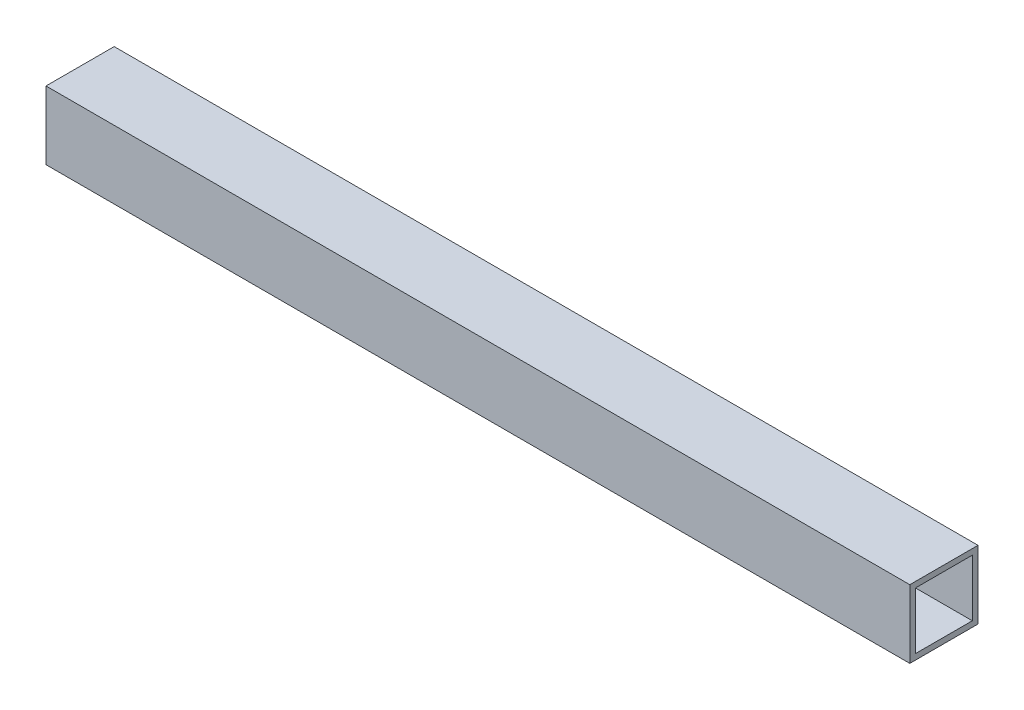
ISO-10303-21;
HEADER;
FILE_DESCRIPTION(('STEP AP214'),'2;1');
FILE_NAME('part.step','',(''),(''),'','','');
FILE_SCHEMA(('AUTOMOTIVE_DESIGN { 1 0 10303 214 1 1 1 1 }'));
ENDSEC;
DATA;
#1=APPLICATION_CONTEXT('core data for automotive mechanical design processes');
#2=APPLICATION_PROTOCOL_DEFINITION('international standard','automotive_design',2000,#1);
#3=PRODUCT_CONTEXT('',#1,'mechanical');
#4=PRODUCT('Part','Part','',(#3));
#5=PRODUCT_RELATED_PRODUCT_CATEGORY('part','',(#4));
#6=PRODUCT_DEFINITION_FORMATION('','',#4);
#7=PRODUCT_DEFINITION_CONTEXT('part definition',#1,'design');
#8=PRODUCT_DEFINITION('design','',#6,#7);
#9=PRODUCT_DEFINITION_SHAPE('','',#8);
#10=(LENGTH_UNIT() NAMED_UNIT(*) SI_UNIT(.MILLI.,.METRE.));
#11=(NAMED_UNIT(*) PLANE_ANGLE_UNIT() SI_UNIT($,.RADIAN.));
#12=(NAMED_UNIT(*) SI_UNIT($,.STERADIAN.) SOLID_ANGLE_UNIT());
#13=UNCERTAINTY_MEASURE_WITH_UNIT(LENGTH_MEASURE(1.E-05),#10,'distance_accuracy_value','');
#14=(GEOMETRIC_REPRESENTATION_CONTEXT(3) GLOBAL_UNCERTAINTY_ASSIGNED_CONTEXT((#13)) GLOBAL_UNIT_ASSIGNED_CONTEXT((#10,
#11,#12)) REPRESENTATION_CONTEXT('',''));
#15=CARTESIAN_POINT('',(0.,0.,0.));
#16=DIRECTION('',(0.,0.,1.));
#17=DIRECTION('',(1.,0.,0.));
#18=AXIS2_PLACEMENT_3D('',#15,#16,#17);
#19=CARTESIAN_POINT('',(241.3,0.,0.));
#20=DIRECTION('',(-1.,0.,0.));
#21=DIRECTION('',(0.,0.,1.));
#22=AXIS2_PLACEMENT_3D('',#19,#20,#21);
#23=PLANE('',#22);
#24=DIRECTION('',(0.,1.,0.));
#25=VECTOR('',#24,1.);
#26=CARTESIAN_POINT('',(241.3,-9.525,-9.525));
#27=LINE('',#26,#25);
#28=CARTESIAN_POINT('',(241.3,-9.525,-9.525));
#29=VERTEX_POINT('',#28);
#30=CARTESIAN_POINT('',(241.3,9.525,-9.525));
#31=VERTEX_POINT('',#30);
#32=EDGE_CURVE('E133',#29,#31,#27,.T.);
#33=ORIENTED_EDGE('',*,*,#32,.T.);
#34=DIRECTION('',(0.,0.,1.));
#35=VECTOR('',#34,1.);
#36=CARTESIAN_POINT('',(241.3,9.525,9.525));
#37=LINE('',#36,#35);
#38=CARTESIAN_POINT('',(241.3,9.525,9.525));
#39=VERTEX_POINT('',#38);
#40=EDGE_CURVE('E136',#31,#39,#37,.T.);
#41=ORIENTED_EDGE('',*,*,#40,.T.);
#42=DIRECTION('',(0.,-1.,0.));
#43=VECTOR('',#42,1.);
#44=CARTESIAN_POINT('',(241.3,-9.525,9.525));
#45=LINE('',#44,#43);
#46=CARTESIAN_POINT('',(241.3,-9.525,9.525));
#47=VERTEX_POINT('',#46);
#48=EDGE_CURVE('E139',#39,#47,#45,.T.);
#49=ORIENTED_EDGE('',*,*,#48,.T.);
#50=DIRECTION('',(0.,0.,-1.));
#51=VECTOR('',#50,1.);
#52=CARTESIAN_POINT('',(241.3,-9.525,9.525));
#53=LINE('',#52,#51);
#54=EDGE_CURVE('E141',#47,#29,#53,.T.);
#55=ORIENTED_EDGE('',*,*,#54,.T.);
#56=EDGE_LOOP('',(#33,#41,#49,#55));
#57=FACE_BOUND('',#56,.T.);
#58=DIRECTION('',(0.,1.,0.));
#59=VECTOR('',#58,1.);
#60=CARTESIAN_POINT('',(241.3,-7.9375,-7.9375));
#61=LINE('',#60,#59);
#62=CARTESIAN_POINT('',(241.3,-7.9375,-7.9375));
#63=VERTEX_POINT('',#62);
#64=CARTESIAN_POINT('',(241.3,7.9375,-7.9375));
#65=VERTEX_POINT('',#64);
#66=EDGE_CURVE('E97',#63,#65,#61,.T.);
#67=ORIENTED_EDGE('',*,*,#66,.F.);
#68=DIRECTION('',(0.,0.,-1.));
#69=VECTOR('',#68,1.);
#70=CARTESIAN_POINT('',(241.3,-7.9375,7.9375));
#71=LINE('',#70,#69);
#72=CARTESIAN_POINT('',(241.3,-7.9375,7.9375));
#73=VERTEX_POINT('',#72);
#74=EDGE_CURVE('E119',#73,#63,#71,.T.);
#75=ORIENTED_EDGE('',*,*,#74,.F.);
#76=DIRECTION('',(0.,-1.,0.));
#77=VECTOR('',#76,1.);
#78=CARTESIAN_POINT('',(241.3,-7.9375,7.9375));
#79=LINE('',#78,#77);
#80=CARTESIAN_POINT('',(241.3,7.9375,7.9375));
#81=VERTEX_POINT('',#80);
#82=EDGE_CURVE('E117',#81,#73,#79,.T.);
#83=ORIENTED_EDGE('',*,*,#82,.F.);
#84=DIRECTION('',(0.,0.,1.));
#85=VECTOR('',#84,1.);
#86=CARTESIAN_POINT('',(241.3,7.9375,7.9375));
#87=LINE('',#86,#85);
#88=EDGE_CURVE('E105',#65,#81,#87,.T.);
#89=ORIENTED_EDGE('',*,*,#88,.F.);
#90=EDGE_LOOP('',(#67,#75,#83,#89));
#91=FACE_BOUND('',#90,.T.);
#92=ADVANCED_FACE('F32',(#57,#91),#23,.F.);
#93=CARTESIAN_POINT('',(0.,0.,0.));
#94=DIRECTION('',(-1.,0.,0.));
#95=DIRECTION('',(0.,0.,1.));
#96=AXIS2_PLACEMENT_3D('',#93,#94,#95);
#97=PLANE('',#96);
#98=DIRECTION('',(0.,1.,0.));
#99=VECTOR('',#98,1.);
#100=CARTESIAN_POINT('',(0.,-9.525,-9.525));
#101=LINE('',#100,#99);
#102=CARTESIAN_POINT('',(0.,-9.525,-9.525));
#103=VERTEX_POINT('',#102);
#104=CARTESIAN_POINT('',(0.,9.525,-9.525));
#105=VERTEX_POINT('',#104);
#106=EDGE_CURVE('E113',#103,#105,#101,.T.);
#107=ORIENTED_EDGE('',*,*,#106,.F.);
#108=DIRECTION('',(0.,0.,-1.));
#109=VECTOR('',#108,1.);
#110=CARTESIAN_POINT('',(0.,-9.525,9.525));
#111=LINE('',#110,#109);
#112=CARTESIAN_POINT('',(0.,-9.525,9.525));
#113=VERTEX_POINT('',#112);
#114=EDGE_CURVE('E137',#113,#103,#111,.T.);
#115=ORIENTED_EDGE('',*,*,#114,.F.);
#116=DIRECTION('',(0.,-1.,0.));
#117=VECTOR('',#116,1.);
#118=CARTESIAN_POINT('',(0.,-9.525,9.525));
#119=LINE('',#118,#117);
#120=CARTESIAN_POINT('',(0.,9.525,9.525));
#121=VERTEX_POINT('',#120);
#122=EDGE_CURVE('E148',#121,#113,#119,.T.);
#123=ORIENTED_EDGE('',*,*,#122,.F.);
#124=DIRECTION('',(0.,0.,1.));
#125=VECTOR('',#124,1.);
#126=CARTESIAN_POINT('',(0.,9.525,9.525));
#127=LINE('',#126,#125);
#128=EDGE_CURVE('E146',#105,#121,#127,.T.);
#129=ORIENTED_EDGE('',*,*,#128,.F.);
#130=EDGE_LOOP('',(#107,#115,#123,#129));
#131=FACE_BOUND('',#130,.T.);
#132=DIRECTION('',(0.,0.,-1.));
#133=VECTOR('',#132,1.);
#134=CARTESIAN_POINT('',(0.,-7.9375,7.9375));
#135=LINE('',#134,#133);
#136=CARTESIAN_POINT('',(0.,-7.9375,7.9375));
#137=VERTEX_POINT('',#136);
#138=CARTESIAN_POINT('',(0.,-7.9375,-7.9375));
#139=VERTEX_POINT('',#138);
#140=EDGE_CURVE('E106',#137,#139,#135,.T.);
#141=ORIENTED_EDGE('',*,*,#140,.T.);
#142=DIRECTION('',(0.,1.,0.));
#143=VECTOR('',#142,1.);
#144=CARTESIAN_POINT('',(0.,-7.9375,-7.9375));
#145=LINE('',#144,#143);
#146=CARTESIAN_POINT('',(0.,7.9375,-7.9375));
#147=VERTEX_POINT('',#146);
#148=EDGE_CURVE('E55',#139,#147,#145,.T.);
#149=ORIENTED_EDGE('',*,*,#148,.T.);
#150=DIRECTION('',(0.,0.,1.));
#151=VECTOR('',#150,1.);
#152=CARTESIAN_POINT('',(0.,7.9375,7.9375));
#153=LINE('',#152,#151);
#154=CARTESIAN_POINT('',(0.,7.9375,7.9375));
#155=VERTEX_POINT('',#154);
#156=EDGE_CURVE('E112',#147,#155,#153,.T.);
#157=ORIENTED_EDGE('',*,*,#156,.T.);
#158=DIRECTION('',(0.,-1.,0.));
#159=VECTOR('',#158,1.);
#160=CARTESIAN_POINT('',(0.,-7.9375,7.9375));
#161=LINE('',#160,#159);
#162=EDGE_CURVE('E125',#155,#137,#161,.T.);
#163=ORIENTED_EDGE('',*,*,#162,.T.);
#164=EDGE_LOOP('',(#141,#149,#157,#163));
#165=FACE_BOUND('',#164,.T.);
#166=ADVANCED_FACE('F166',(#131,#165),#97,.T.);
#167=CARTESIAN_POINT('',(241.3,-9.525,-9.525));
#168=DIRECTION('',(0.,0.,1.));
#169=DIRECTION('',(1.,0.,0.));
#170=AXIS2_PLACEMENT_3D('',#167,#168,#169);
#171=PLANE('',#170);
#172=ORIENTED_EDGE('',*,*,#106,.T.);
#173=DIRECTION('',(-1.,0.,0.));
#174=VECTOR('',#173,1.);
#175=CARTESIAN_POINT('',(241.3,9.525,-9.525));
#176=LINE('',#175,#174);
#177=EDGE_CURVE('E11',#31,#105,#176,.T.);
#178=ORIENTED_EDGE('',*,*,#177,.F.);
#179=ORIENTED_EDGE('',*,*,#32,.F.);
#180=DIRECTION('',(-1.,0.,0.));
#181=VECTOR('',#180,1.);
#182=CARTESIAN_POINT('',(241.3,-9.525,-9.525));
#183=LINE('',#182,#181);
#184=EDGE_CURVE('E143',#29,#103,#183,.T.);
#185=ORIENTED_EDGE('',*,*,#184,.T.);
#186=EDGE_LOOP('',(#172,#178,#179,#185));
#187=FACE_BOUND('',#186,.T.);
#188=ADVANCED_FACE('F34',(#187),#171,.F.);
#189=CARTESIAN_POINT('',(241.3,9.525,9.525));
#190=DIRECTION('',(0.,-1.,0.));
#191=DIRECTION('',(0.,0.,-1.));
#192=AXIS2_PLACEMENT_3D('',#189,#190,#191);
#193=PLANE('',#192);
#194=ORIENTED_EDGE('',*,*,#128,.T.);
#195=DIRECTION('',(-1.,0.,0.));
#196=VECTOR('',#195,1.);
#197=CARTESIAN_POINT('',(241.3,9.525,9.525));
#198=LINE('',#197,#196);
#199=EDGE_CURVE('E40',#39,#121,#198,.T.);
#200=ORIENTED_EDGE('',*,*,#199,.F.);
#201=ORIENTED_EDGE('',*,*,#40,.F.);
#202=ORIENTED_EDGE('',*,*,#177,.T.);
#203=EDGE_LOOP('',(#194,#200,#201,#202));
#204=FACE_BOUND('',#203,.T.);
#205=ADVANCED_FACE('F176',(#204),#193,.F.);
#206=CARTESIAN_POINT('',(241.3,-9.525,9.525));
#207=DIRECTION('',(0.,0.,-1.));
#208=DIRECTION('',(-1.,0.,0.));
#209=AXIS2_PLACEMENT_3D('',#206,#207,#208);
#210=PLANE('',#209);
#211=ORIENTED_EDGE('',*,*,#122,.T.);
#212=DIRECTION('',(-1.,0.,0.));
#213=VECTOR('',#212,1.);
#214=CARTESIAN_POINT('',(241.3,-9.525,9.525));
#215=LINE('',#214,#213);
#216=EDGE_CURVE('E153',#47,#113,#215,.T.);
#217=ORIENTED_EDGE('',*,*,#216,.F.);
#218=ORIENTED_EDGE('',*,*,#48,.F.);
#219=ORIENTED_EDGE('',*,*,#199,.T.);
#220=EDGE_LOOP('',(#211,#217,#218,#219));
#221=FACE_BOUND('',#220,.T.);
#222=ADVANCED_FACE('F160',(#221),#210,.F.);
#223=CARTESIAN_POINT('',(241.3,-9.525,9.525));
#224=DIRECTION('',(0.,1.,0.));
#225=DIRECTION('',(0.,0.,1.));
#226=AXIS2_PLACEMENT_3D('',#223,#224,#225);
#227=PLANE('',#226);
#228=ORIENTED_EDGE('',*,*,#114,.T.);
#229=ORIENTED_EDGE('',*,*,#184,.F.);
#230=ORIENTED_EDGE('',*,*,#54,.F.);
#231=ORIENTED_EDGE('',*,*,#216,.T.);
#232=EDGE_LOOP('',(#228,#229,#230,#231));
#233=FACE_BOUND('',#232,.T.);
#234=ADVANCED_FACE('F170',(#233),#227,.F.);
#235=CARTESIAN_POINT('',(241.3,-7.9375,-7.9375));
#236=DIRECTION('',(0.,0.,1.));
#237=DIRECTION('',(1.,0.,0.));
#238=AXIS2_PLACEMENT_3D('',#235,#236,#237);
#239=PLANE('',#238);
#240=ORIENTED_EDGE('',*,*,#148,.F.);
#241=DIRECTION('',(-1.,0.,0.));
#242=VECTOR('',#241,1.);
#243=CARTESIAN_POINT('',(241.3,-7.9375,-7.9375));
#244=LINE('',#243,#242);
#245=EDGE_CURVE('E101',#63,#139,#244,.T.);
#246=ORIENTED_EDGE('',*,*,#245,.F.);
#247=ORIENTED_EDGE('',*,*,#66,.T.);
#248=DIRECTION('',(-1.,0.,0.));
#249=VECTOR('',#248,1.);
#250=CARTESIAN_POINT('',(241.3,7.9375,-7.9375));
#251=LINE('',#250,#249);
#252=EDGE_CURVE('E100',#65,#147,#251,.T.);
#253=ORIENTED_EDGE('',*,*,#252,.T.);
#254=EDGE_LOOP('',(#240,#246,#247,#253));
#255=FACE_BOUND('',#254,.T.);
#256=ADVANCED_FACE('F99',(#255),#239,.T.);
#257=CARTESIAN_POINT('',(241.3,7.9375,7.9375));
#258=DIRECTION('',(0.,-1.,0.));
#259=DIRECTION('',(0.,0.,-1.));
#260=AXIS2_PLACEMENT_3D('',#257,#258,#259);
#261=PLANE('',#260);
#262=ORIENTED_EDGE('',*,*,#156,.F.);
#263=ORIENTED_EDGE('',*,*,#252,.F.);
#264=ORIENTED_EDGE('',*,*,#88,.T.);
#265=DIRECTION('',(-1.,0.,0.));
#266=VECTOR('',#265,1.);
#267=CARTESIAN_POINT('',(241.3,7.9375,7.9375));
#268=LINE('',#267,#266);
#269=EDGE_CURVE('E114',#81,#155,#268,.T.);
#270=ORIENTED_EDGE('',*,*,#269,.T.);
#271=EDGE_LOOP('',(#262,#263,#264,#270));
#272=FACE_BOUND('',#271,.T.);
#273=ADVANCED_FACE('F109',(#272),#261,.T.);
#274=CARTESIAN_POINT('',(241.3,-7.9375,7.9375));
#275=DIRECTION('',(0.,0.,-1.));
#276=DIRECTION('',(-1.,0.,0.));
#277=AXIS2_PLACEMENT_3D('',#274,#275,#276);
#278=PLANE('',#277);
#279=ORIENTED_EDGE('',*,*,#162,.F.);
#280=ORIENTED_EDGE('',*,*,#269,.F.);
#281=ORIENTED_EDGE('',*,*,#82,.T.);
#282=DIRECTION('',(-1.,0.,0.));
#283=VECTOR('',#282,1.);
#284=CARTESIAN_POINT('',(241.3,-7.9375,7.9375));
#285=LINE('',#284,#283);
#286=EDGE_CURVE('E47',#73,#137,#285,.T.);
#287=ORIENTED_EDGE('',*,*,#286,.T.);
#288=EDGE_LOOP('',(#279,#280,#281,#287));
#289=FACE_BOUND('',#288,.T.);
#290=ADVANCED_FACE('F199',(#289),#278,.T.);
#291=CARTESIAN_POINT('',(241.3,-7.9375,7.9375));
#292=DIRECTION('',(0.,1.,0.));
#293=DIRECTION('',(0.,0.,1.));
#294=AXIS2_PLACEMENT_3D('',#291,#292,#293);
#295=PLANE('',#294);
#296=ORIENTED_EDGE('',*,*,#140,.F.);
#297=ORIENTED_EDGE('',*,*,#286,.F.);
#298=ORIENTED_EDGE('',*,*,#74,.T.);
#299=ORIENTED_EDGE('',*,*,#245,.T.);
#300=EDGE_LOOP('',(#296,#297,#298,#299));
#301=FACE_BOUND('',#300,.T.);
#302=ADVANCED_FACE('F203',(#301),#295,.T.);
#303=CLOSED_SHELL('',(#92,#166,#188,#205,#222,#234,#256,#273,#290,#302));
#304=MANIFOLD_SOLID_BREP('B2',#303);
#305=ADVANCED_BREP_SHAPE_REPRESENTATION('',(#18,#304),#14);
#306=SHAPE_DEFINITION_REPRESENTATION(#9,#305);
ENDSEC;
END-ISO-10303-21;
